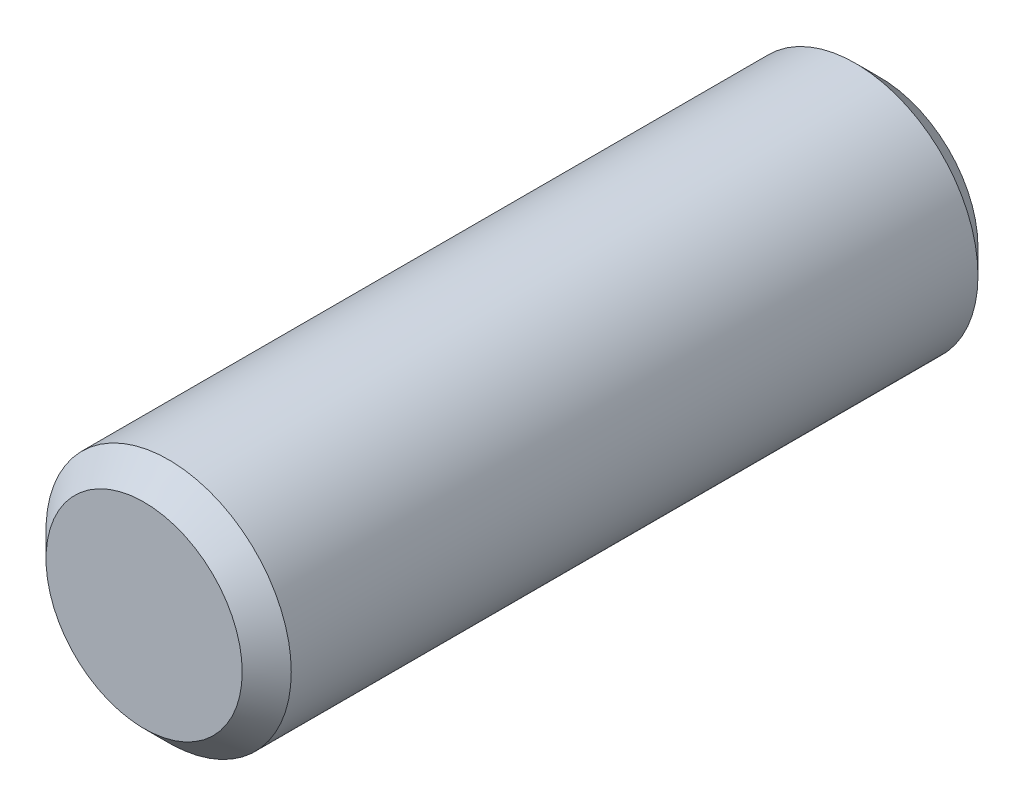
ISO-10303-21;
HEADER;
FILE_DESCRIPTION(('STEP AP214'),'2;1');
FILE_NAME('part.step','',(''),(''),'','','');
FILE_SCHEMA(('AUTOMOTIVE_DESIGN { 1 0 10303 214 1 1 1 1 }'));
ENDSEC;
DATA;
#1=APPLICATION_CONTEXT('core data for automotive mechanical design processes');
#2=APPLICATION_PROTOCOL_DEFINITION('international standard','automotive_design',2000,#1);
#3=PRODUCT_CONTEXT('',#1,'mechanical');
#4=PRODUCT('Part','Part','',(#3));
#5=PRODUCT_RELATED_PRODUCT_CATEGORY('part','',(#4));
#6=PRODUCT_DEFINITION_FORMATION('','',#4);
#7=PRODUCT_DEFINITION_CONTEXT('part definition',#1,'design');
#8=PRODUCT_DEFINITION('design','',#6,#7);
#9=PRODUCT_DEFINITION_SHAPE('','',#8);
#10=(LENGTH_UNIT() NAMED_UNIT(*) SI_UNIT(.MILLI.,.METRE.));
#11=(NAMED_UNIT(*) PLANE_ANGLE_UNIT() SI_UNIT($,.RADIAN.));
#12=(NAMED_UNIT(*) SI_UNIT($,.STERADIAN.) SOLID_ANGLE_UNIT());
#13=UNCERTAINTY_MEASURE_WITH_UNIT(LENGTH_MEASURE(1.E-05),#10,'distance_accuracy_value','');
#14=(GEOMETRIC_REPRESENTATION_CONTEXT(3) GLOBAL_UNCERTAINTY_ASSIGNED_CONTEXT((#13)) GLOBAL_UNIT_ASSIGNED_CONTEXT((#10,
#11,#12)) REPRESENTATION_CONTEXT('',''));
#15=CARTESIAN_POINT('',(0.,0.,0.));
#16=DIRECTION('',(0.,0.,1.));
#17=DIRECTION('',(1.,0.,0.));
#18=AXIS2_PLACEMENT_3D('',#15,#16,#17);
#19=CARTESIAN_POINT('',(0.,0.,6.));
#20=DIRECTION('',(0.,0.,-1.));
#21=DIRECTION('',(-1.,0.,0.));
#22=AXIS2_PLACEMENT_3D('',#19,#20,#21);
#23=CYLINDRICAL_SURFACE('',#22,1.);
#24=CARTESIAN_POINT('',(0.,0.,0.199999999999998));
#25=DIRECTION('',(0.,0.,1.));
#26=DIRECTION('',(1.,0.,0.));
#27=AXIS2_PLACEMENT_3D('',#24,#25,#26);
#28=CIRCLE('',#27,1.);
#29=CARTESIAN_POINT('',(1.,0.,0.199999999999998));
#30=VERTEX_POINT('',#29);
#31=EDGE_CURVE('E50',#30,#30,#28,.T.);
#32=ORIENTED_EDGE('',*,*,#31,.T.);
#33=EDGE_LOOP('',(#32));
#34=FACE_BOUND('',#33,.T.);
#35=CARTESIAN_POINT('',(0.,0.,5.8));
#36=DIRECTION('',(0.,0.,1.));
#37=DIRECTION('',(1.,0.,0.));
#38=AXIS2_PLACEMENT_3D('',#35,#36,#37);
#39=CIRCLE('',#38,1.);
#40=CARTESIAN_POINT('',(1.,0.,5.8));
#41=VERTEX_POINT('',#40);
#42=EDGE_CURVE('E54',#41,#41,#39,.F.);
#43=ORIENTED_EDGE('',*,*,#42,.T.);
#44=EDGE_LOOP('',(#43));
#45=FACE_BOUND('',#44,.T.);
#46=ADVANCED_FACE('F38',(#34,#45),#23,.T.);
#47=CARTESIAN_POINT('',(0.,0.,6.));
#48=DIRECTION('',(0.,0.,1.));
#49=DIRECTION('',(1.,0.,0.));
#50=AXIS2_PLACEMENT_3D('',#47,#48,#49);
#51=PLANE('',#50);
#52=CARTESIAN_POINT('',(0.,0.,6.));
#53=DIRECTION('',(0.,0.,1.));
#54=DIRECTION('',(1.,0.,0.));
#55=AXIS2_PLACEMENT_3D('',#52,#53,#54);
#56=CIRCLE('',#55,0.8);
#57=CARTESIAN_POINT('',(0.8,0.,6.));
#58=VERTEX_POINT('',#57);
#59=EDGE_CURVE('E10',#58,#58,#56,.T.);
#60=ORIENTED_EDGE('',*,*,#59,.T.);
#61=EDGE_LOOP('',(#60));
#62=FACE_BOUND('',#61,.T.);
#63=ADVANCED_FACE('F70',(#62),#51,.T.);
#64=CARTESIAN_POINT('',(0.,0.,0.));
#65=DIRECTION('',(0.,0.,1.));
#66=DIRECTION('',(1.,0.,0.));
#67=AXIS2_PLACEMENT_3D('',#64,#65,#66);
#68=PLANE('',#67);
#69=CARTESIAN_POINT('',(0.,0.,0.));
#70=DIRECTION('',(0.,0.,1.));
#71=DIRECTION('',(1.,0.,0.));
#72=AXIS2_PLACEMENT_3D('',#69,#70,#71);
#73=CIRCLE('',#72,0.800000000000002);
#74=CARTESIAN_POINT('',(0.800000000000002,0.,0.));
#75=VERTEX_POINT('',#74);
#76=EDGE_CURVE('E46',#75,#75,#73,.F.);
#77=ORIENTED_EDGE('',*,*,#76,.T.);
#78=EDGE_LOOP('',(#77));
#79=FACE_BOUND('',#78,.T.);
#80=ADVANCED_FACE('F67',(#79),#68,.F.);
#81=CARTESIAN_POINT('',(0.,0.,0.199999999999998));
#82=DIRECTION('',(0.,0.,1.));
#83=DIRECTION('',(1.,0.,0.));
#84=AXIS2_PLACEMENT_3D('',#81,#82,#83);
#85=CONICAL_SURFACE('',#84,1.,0.785398163397449);
#86=ORIENTED_EDGE('',*,*,#76,.F.);
#87=EDGE_LOOP('',(#86));
#88=FACE_BOUND('',#87,.T.);
#89=ORIENTED_EDGE('',*,*,#31,.F.);
#90=EDGE_LOOP('',(#89));
#91=FACE_BOUND('',#90,.T.);
#92=ADVANCED_FACE('F63',(#88,#91),#85,.T.);
#93=CARTESIAN_POINT('',(0.,0.,6.));
#94=DIRECTION('',(0.,0.,-1.));
#95=DIRECTION('',(-1.,0.,0.));
#96=AXIS2_PLACEMENT_3D('',#93,#94,#95);
#97=CONICAL_SURFACE('',#96,0.8,0.785398163397446);
#98=ORIENTED_EDGE('',*,*,#42,.F.);
#99=EDGE_LOOP('',(#98));
#100=FACE_BOUND('',#99,.T.);
#101=ORIENTED_EDGE('',*,*,#59,.F.);
#102=EDGE_LOOP('',(#101));
#103=FACE_BOUND('',#102,.T.);
#104=ADVANCED_FACE('F41',(#100,#103),#97,.T.);
#105=CLOSED_SHELL('',(#46,#63,#80,#92,#104));
#106=MANIFOLD_SOLID_BREP('B2',#105);
#107=ADVANCED_BREP_SHAPE_REPRESENTATION('',(#18,#106),#14);
#108=SHAPE_DEFINITION_REPRESENTATION(#9,#107);
ENDSEC;
END-ISO-10303-21;
